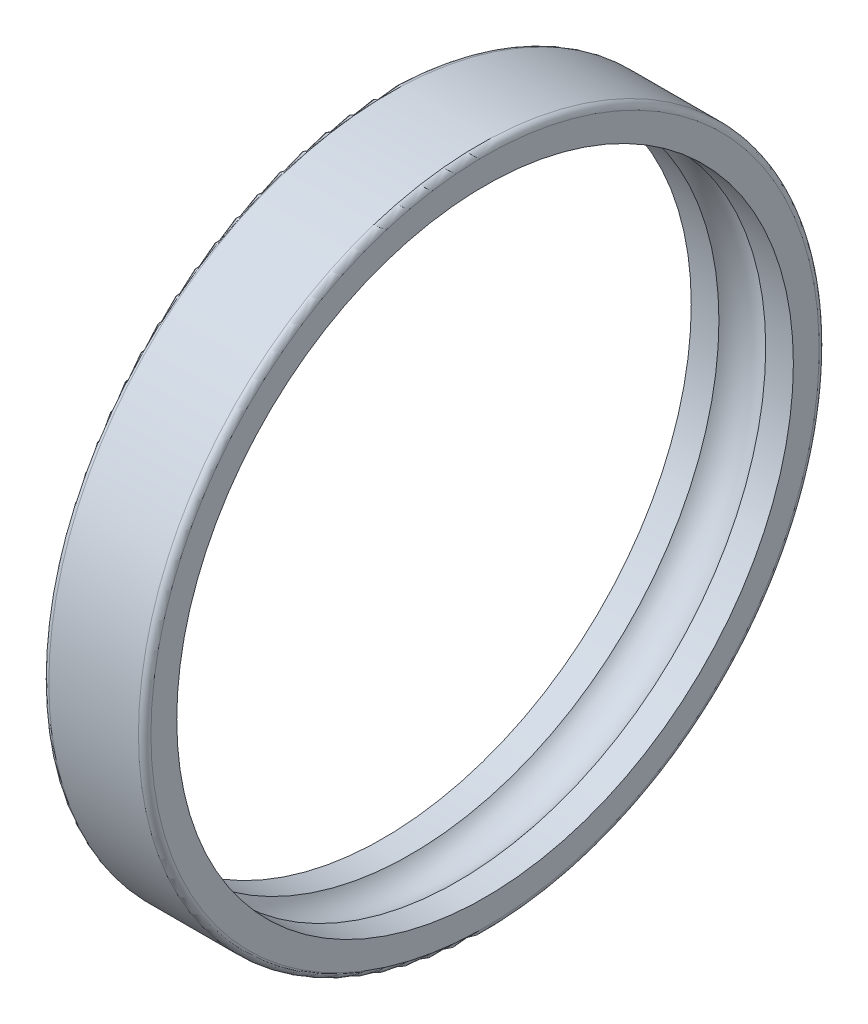
ISO-10303-21;
HEADER;
FILE_DESCRIPTION(('STEP AP214'),'2;1');
FILE_NAME('part.step','',(''),(''),'','','');
FILE_SCHEMA(('AUTOMOTIVE_DESIGN { 1 0 10303 214 1 1 1 1 }'));
ENDSEC;
DATA;
#1=APPLICATION_CONTEXT('core data for automotive mechanical design processes');
#2=APPLICATION_PROTOCOL_DEFINITION('international standard','automotive_design',2000,#1);
#3=PRODUCT_CONTEXT('',#1,'mechanical');
#4=PRODUCT('Part','Part','',(#3));
#5=PRODUCT_RELATED_PRODUCT_CATEGORY('part','',(#4));
#6=PRODUCT_DEFINITION_FORMATION('','',#4);
#7=PRODUCT_DEFINITION_CONTEXT('part definition',#1,'design');
#8=PRODUCT_DEFINITION('design','',#6,#7);
#9=PRODUCT_DEFINITION_SHAPE('','',#8);
#10=(LENGTH_UNIT() NAMED_UNIT(*) SI_UNIT(.MILLI.,.METRE.));
#11=(NAMED_UNIT(*) PLANE_ANGLE_UNIT() SI_UNIT($,.RADIAN.));
#12=(NAMED_UNIT(*) SI_UNIT($,.STERADIAN.) SOLID_ANGLE_UNIT());
#13=UNCERTAINTY_MEASURE_WITH_UNIT(LENGTH_MEASURE(1.E-05),#10,'distance_accuracy_value','');
#14=(GEOMETRIC_REPRESENTATION_CONTEXT(3) GLOBAL_UNCERTAINTY_ASSIGNED_CONTEXT((#13)) GLOBAL_UNIT_ASSIGNED_CONTEXT((#10,
#11,#12)) REPRESENTATION_CONTEXT('',''));
#15=CARTESIAN_POINT('',(0.,0.,0.));
#16=DIRECTION('',(0.,0.,1.));
#17=DIRECTION('',(1.,0.,0.));
#18=AXIS2_PLACEMENT_3D('',#15,#16,#17);
#19=CARTESIAN_POINT('',(1.10000000000035,0.,0.));
#20=DIRECTION('',(-1.,0.,0.));
#21=DIRECTION('',(0.,0.,1.));
#22=AXIS2_PLACEMENT_3D('',#19,#20,#21);
#23=TOROIDAL_SURFACE('',#22,58.8999999999997,1.10000000000035);
#24=CARTESIAN_POINT('',(0.,0.,0.));
#25=DIRECTION('',(-1.,0.,0.));
#26=DIRECTION('',(0.,0.,1.));
#27=AXIS2_PLACEMENT_3D('',#24,#25,#26);
#28=CIRCLE('',#27,58.9);
#29=CARTESIAN_POINT('',(0.,0.,58.9));
#30=VERTEX_POINT('',#29);
#31=EDGE_CURVE('E10',#30,#30,#28,.T.);
#32=ORIENTED_EDGE('',*,*,#31,.F.);
#33=EDGE_LOOP('',(#32));
#34=FACE_BOUND('',#33,.T.);
#35=CARTESIAN_POINT('',(1.09999999999999,0.,0.));
#36=DIRECTION('',(-1.,0.,0.));
#37=DIRECTION('',(0.,0.,1.));
#38=AXIS2_PLACEMENT_3D('',#35,#36,#37);
#39=CIRCLE('',#38,60.);
#40=CARTESIAN_POINT('',(1.09999999999999,0.,60.));
#41=VERTEX_POINT('',#40);
#42=EDGE_CURVE('E59',#41,#41,#39,.T.);
#43=ORIENTED_EDGE('',*,*,#42,.T.);
#44=EDGE_LOOP('',(#43));
#45=FACE_BOUND('',#44,.T.);
#46=ADVANCED_FACE('F31',(#34,#45),#23,.T.);
#47=CARTESIAN_POINT('',(0.,58.9,0.));
#48=DIRECTION('',(1.,0.,0.));
#49=DIRECTION('',(0.,0.,-1.));
#50=AXIS2_PLACEMENT_3D('',#47,#48,#49);
#51=PLANE('',#50);
#52=CARTESIAN_POINT('',(0.,0.,0.));
#53=DIRECTION('',(-1.,0.,0.));
#54=DIRECTION('',(0.,0.,1.));
#55=AXIS2_PLACEMENT_3D('',#52,#53,#54);
#56=CIRCLE('',#55,54.35);
#57=CARTESIAN_POINT('',(0.,0.,54.35));
#58=VERTEX_POINT('',#57);
#59=EDGE_CURVE('E37',#58,#58,#56,.T.);
#60=ORIENTED_EDGE('',*,*,#59,.F.);
#61=EDGE_LOOP('',(#60));
#62=FACE_BOUND('',#61,.T.);
#63=ORIENTED_EDGE('',*,*,#31,.T.);
#64=EDGE_LOOP('',(#63));
#65=FACE_BOUND('',#64,.T.);
#66=ADVANCED_FACE('F96',(#62,#65),#51,.F.);
#67=CARTESIAN_POINT('',(200.,0.,0.));
#68=DIRECTION('',(-1.,0.,0.));
#69=DIRECTION('',(0.,0.,1.));
#70=AXIS2_PLACEMENT_3D('',#67,#68,#69);
#71=CYLINDRICAL_SURFACE('',#70,54.35);
#72=CARTESIAN_POINT('',(4.87562850242609,0.,0.));
#73=DIRECTION('',(-1.,0.,0.));
#74=DIRECTION('',(0.,0.,1.));
#75=AXIS2_PLACEMENT_3D('',#72,#73,#74);
#76=CIRCLE('',#75,54.35);
#77=CARTESIAN_POINT('',(4.87562850242609,0.,54.35));
#78=VERTEX_POINT('',#77);
#79=EDGE_CURVE('E41',#78,#78,#76,.T.);
#80=ORIENTED_EDGE('',*,*,#79,.F.);
#81=EDGE_LOOP('',(#80));
#82=FACE_BOUND('',#81,.T.);
#83=ORIENTED_EDGE('',*,*,#59,.T.);
#84=EDGE_LOOP('',(#83));
#85=FACE_BOUND('',#84,.T.);
#86=ADVANCED_FACE('F91',(#82,#85),#71,.F.);
#87=CARTESIAN_POINT('',(9.00000000000005,0.,0.));
#88=DIRECTION('',(-1.,0.,0.));
#89=DIRECTION('',(0.,0.,1.));
#90=AXIS2_PLACEMENT_3D('',#87,#88,#89);
#91=TOROIDAL_SURFACE('',#90,51.2499999999999,5.1595000000001);
#92=CARTESIAN_POINT('',(13.124371497574,0.,0.));
#93=DIRECTION('',(-1.,0.,0.));
#94=DIRECTION('',(0.,0.,1.));
#95=AXIS2_PLACEMENT_3D('',#92,#93,#94);
#96=CIRCLE('',#95,54.35);
#97=CARTESIAN_POINT('',(13.124371497574,0.,54.35));
#98=VERTEX_POINT('',#97);
#99=EDGE_CURVE('E45',#98,#98,#96,.T.);
#100=ORIENTED_EDGE('',*,*,#99,.F.);
#101=EDGE_LOOP('',(#100));
#102=FACE_BOUND('',#101,.T.);
#103=ORIENTED_EDGE('',*,*,#79,.T.);
#104=EDGE_LOOP('',(#103));
#105=FACE_BOUND('',#104,.T.);
#106=ADVANCED_FACE('F85',(#102,#105),#91,.F.);
#107=CARTESIAN_POINT('',(200.,0.,0.));
#108=DIRECTION('',(-1.,0.,0.));
#109=DIRECTION('',(0.,0.,1.));
#110=AXIS2_PLACEMENT_3D('',#107,#108,#109);
#111=CYLINDRICAL_SURFACE('',#110,54.35);
#112=CARTESIAN_POINT('',(18.,0.,0.));
#113=DIRECTION('',(-1.,0.,0.));
#114=DIRECTION('',(0.,0.,1.));
#115=AXIS2_PLACEMENT_3D('',#112,#113,#114);
#116=CIRCLE('',#115,54.35);
#117=CARTESIAN_POINT('',(18.,0.,54.35));
#118=VERTEX_POINT('',#117);
#119=EDGE_CURVE('E50',#118,#118,#116,.T.);
#120=ORIENTED_EDGE('',*,*,#119,.F.);
#121=EDGE_LOOP('',(#120));
#122=FACE_BOUND('',#121,.T.);
#123=ORIENTED_EDGE('',*,*,#99,.T.);
#124=EDGE_LOOP('',(#123));
#125=FACE_BOUND('',#124,.T.);
#126=ADVANCED_FACE('F79',(#122,#125),#111,.F.);
#127=CARTESIAN_POINT('',(18.,54.35,0.));
#128=DIRECTION('',(-1.,0.,0.));
#129=DIRECTION('',(0.,0.,1.));
#130=AXIS2_PLACEMENT_3D('',#127,#128,#129);
#131=PLANE('',#130);
#132=CARTESIAN_POINT('',(18.,0.,0.));
#133=DIRECTION('',(-1.,0.,0.));
#134=DIRECTION('',(0.,0.,1.));
#135=AXIS2_PLACEMENT_3D('',#132,#133,#134);
#136=CIRCLE('',#135,58.9);
#137=CARTESIAN_POINT('',(18.,0.,58.9));
#138=VERTEX_POINT('',#137);
#139=EDGE_CURVE('E53',#138,#138,#136,.T.);
#140=ORIENTED_EDGE('',*,*,#139,.F.);
#141=EDGE_LOOP('',(#140));
#142=FACE_BOUND('',#141,.T.);
#143=ORIENTED_EDGE('',*,*,#119,.T.);
#144=EDGE_LOOP('',(#143));
#145=FACE_BOUND('',#144,.T.);
#146=ADVANCED_FACE('F73',(#142,#145),#131,.F.);
#147=CARTESIAN_POINT('',(16.8999999999993,0.,0.));
#148=DIRECTION('',(-1.,0.,0.));
#149=DIRECTION('',(0.,0.,1.));
#150=AXIS2_PLACEMENT_3D('',#147,#148,#149);
#151=TOROIDAL_SURFACE('',#150,58.8999999999993,1.10000000000069);
#152=CARTESIAN_POINT('',(16.9,0.,0.));
#153=DIRECTION('',(-1.,0.,0.));
#154=DIRECTION('',(0.,0.,1.));
#155=AXIS2_PLACEMENT_3D('',#152,#153,#154);
#156=CIRCLE('',#155,60.);
#157=CARTESIAN_POINT('',(16.9,0.,60.));
#158=VERTEX_POINT('',#157);
#159=EDGE_CURVE('E56',#158,#158,#156,.T.);
#160=ORIENTED_EDGE('',*,*,#159,.F.);
#161=EDGE_LOOP('',(#160));
#162=FACE_BOUND('',#161,.T.);
#163=ORIENTED_EDGE('',*,*,#139,.T.);
#164=EDGE_LOOP('',(#163));
#165=FACE_BOUND('',#164,.T.);
#166=ADVANCED_FACE('F67',(#162,#165),#151,.T.);
#167=CARTESIAN_POINT('',(200.,0.,0.));
#168=DIRECTION('',(-1.,0.,0.));
#169=DIRECTION('',(0.,0.,1.));
#170=AXIS2_PLACEMENT_3D('',#167,#168,#169);
#171=CYLINDRICAL_SURFACE('',#170,60.);
#172=ORIENTED_EDGE('',*,*,#42,.F.);
#173=EDGE_LOOP('',(#172));
#174=FACE_BOUND('',#173,.T.);
#175=ORIENTED_EDGE('',*,*,#159,.T.);
#176=EDGE_LOOP('',(#175));
#177=FACE_BOUND('',#176,.T.);
#178=ADVANCED_FACE('F64',(#174,#177),#171,.T.);
#179=CLOSED_SHELL('',(#46,#66,#86,#106,#126,#146,#166,#178));
#180=MANIFOLD_SOLID_BREP('B2',#179);
#181=ADVANCED_BREP_SHAPE_REPRESENTATION('',(#18,#180),#14);
#182=SHAPE_DEFINITION_REPRESENTATION(#9,#181);
ENDSEC;
END-ISO-10303-21;
